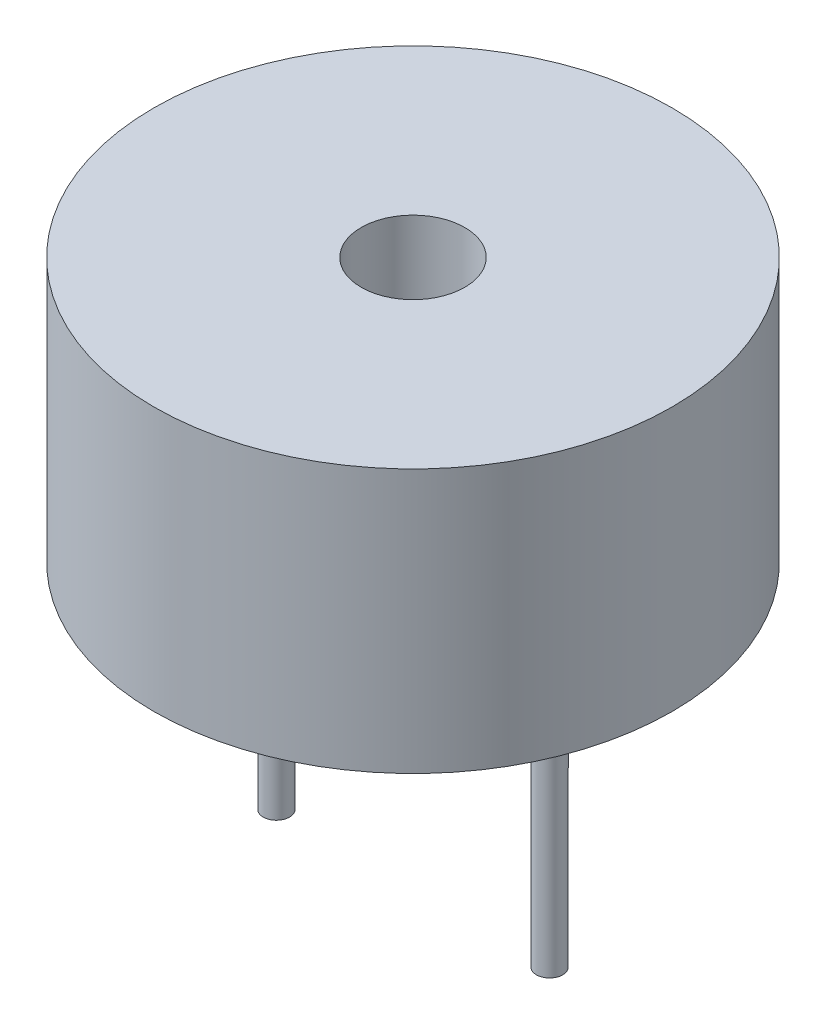
ISO-10303-21;
HEADER;
FILE_DESCRIPTION(('STEP AP214'),'2;1');
FILE_NAME('part.step','',(''),(''),'','','');
FILE_SCHEMA(('AUTOMOTIVE_DESIGN { 1 0 10303 214 1 1 1 1 }'));
ENDSEC;
DATA;
#1=APPLICATION_CONTEXT('core data for automotive mechanical design processes');
#2=APPLICATION_PROTOCOL_DEFINITION('international standard','automotive_design',2000,#1);
#3=PRODUCT_CONTEXT('',#1,'mechanical');
#4=PRODUCT('Part','Part','',(#3));
#5=PRODUCT_RELATED_PRODUCT_CATEGORY('part','',(#4));
#6=PRODUCT_DEFINITION_FORMATION('','',#4);
#7=PRODUCT_DEFINITION_CONTEXT('part definition',#1,'design');
#8=PRODUCT_DEFINITION('design','',#6,#7);
#9=PRODUCT_DEFINITION_SHAPE('','',#8);
#10=(LENGTH_UNIT() NAMED_UNIT(*) SI_UNIT(.MILLI.,.METRE.));
#11=(NAMED_UNIT(*) PLANE_ANGLE_UNIT() SI_UNIT($,.RADIAN.));
#12=(NAMED_UNIT(*) SI_UNIT($,.STERADIAN.) SOLID_ANGLE_UNIT());
#13=UNCERTAINTY_MEASURE_WITH_UNIT(LENGTH_MEASURE(1.E-05),#10,'distance_accuracy_value','');
#14=(GEOMETRIC_REPRESENTATION_CONTEXT(3) GLOBAL_UNCERTAINTY_ASSIGNED_CONTEXT((#13)) GLOBAL_UNIT_ASSIGNED_CONTEXT((#10,
#11,#12)) REPRESENTATION_CONTEXT('',''));
#15=CARTESIAN_POINT('',(0.,0.,0.));
#16=DIRECTION('',(0.,0.,1.));
#17=DIRECTION('',(1.,0.,0.));
#18=AXIS2_PLACEMENT_3D('',#15,#16,#17);
#19=CARTESIAN_POINT('',(0.,0.,0.));
#20=DIRECTION('',(0.,1.,0.));
#21=DIRECTION('',(0.,0.,1.));
#22=AXIS2_PLACEMENT_3D('',#19,#20,#21);
#23=PLANE('',#22);
#24=CARTESIAN_POINT('',(3.683,0.,0.));
#25=DIRECTION('',(0.,1.,0.));
#26=DIRECTION('',(0.,0.,1.));
#27=AXIS2_PLACEMENT_3D('',#24,#25,#26);
#28=CIRCLE('',#27,0.3556);
#29=CARTESIAN_POINT('',(3.683,0.,0.3556));
#30=VERTEX_POINT('',#29);
#31=EDGE_CURVE('E39',#30,#30,#28,.F.);
#32=ORIENTED_EDGE('',*,*,#31,.F.);
#33=EDGE_LOOP('',(#32));
#34=FACE_BOUND('',#33,.T.);
#35=CARTESIAN_POINT('',(0.,0.,0.));
#36=DIRECTION('',(0.,1.,0.));
#37=DIRECTION('',(0.,0.,1.));
#38=AXIS2_PLACEMENT_3D('',#35,#36,#37);
#39=CIRCLE('',#38,6.985);
#40=CARTESIAN_POINT('',(0.,0.,6.985));
#41=VERTEX_POINT('',#40);
#42=EDGE_CURVE('E47',#41,#41,#39,.T.);
#43=ORIENTED_EDGE('',*,*,#42,.F.);
#44=EDGE_LOOP('',(#43));
#45=FACE_BOUND('',#44,.T.);
#46=CARTESIAN_POINT('',(-3.683,0.,0.));
#47=DIRECTION('',(0.,1.,0.));
#48=DIRECTION('',(0.,0.,1.));
#49=AXIS2_PLACEMENT_3D('',#46,#47,#48);
#50=CIRCLE('',#49,0.3556);
#51=CARTESIAN_POINT('',(-3.683,0.,0.3556));
#52=VERTEX_POINT('',#51);
#53=EDGE_CURVE('E10',#52,#52,#50,.F.);
#54=ORIENTED_EDGE('',*,*,#53,.F.);
#55=EDGE_LOOP('',(#54));
#56=FACE_BOUND('',#55,.T.);
#57=ADVANCED_FACE('F32',(#34,#45,#56),#23,.F.);
#58=CARTESIAN_POINT('',(0.,7.112,0.));
#59=DIRECTION('',(0.,-1.,0.));
#60=DIRECTION('',(0.,0.,-1.));
#61=AXIS2_PLACEMENT_3D('',#58,#59,#60);
#62=CYLINDRICAL_SURFACE('',#61,6.985);
#63=CARTESIAN_POINT('',(0.,7.112,0.));
#64=DIRECTION('',(0.,1.,0.));
#65=DIRECTION('',(0.,0.,1.));
#66=AXIS2_PLACEMENT_3D('',#63,#64,#65);
#67=CIRCLE('',#66,6.985);
#68=CARTESIAN_POINT('',(0.,7.112,6.985));
#69=VERTEX_POINT('',#68);
#70=EDGE_CURVE('E43',#69,#69,#67,.T.);
#71=ORIENTED_EDGE('',*,*,#70,.F.);
#72=EDGE_LOOP('',(#71));
#73=FACE_BOUND('',#72,.T.);
#74=ORIENTED_EDGE('',*,*,#42,.T.);
#75=EDGE_LOOP('',(#74));
#76=FACE_BOUND('',#75,.T.);
#77=ADVANCED_FACE('F34',(#73,#76),#62,.T.);
#78=CARTESIAN_POINT('',(0.,7.112,0.));
#79=DIRECTION('',(0.,1.,0.));
#80=DIRECTION('',(0.,0.,1.));
#81=AXIS2_PLACEMENT_3D('',#78,#79,#80);
#82=PLANE('',#81);
#83=CARTESIAN_POINT('',(0.,7.112,0.));
#84=DIRECTION('',(0.,1.,0.));
#85=DIRECTION('',(0.,0.,1.));
#86=AXIS2_PLACEMENT_3D('',#83,#84,#85);
#87=CIRCLE('',#86,1.397);
#88=CARTESIAN_POINT('',(0.,7.112,1.397));
#89=VERTEX_POINT('',#88);
#90=EDGE_CURVE('E59',#89,#89,#87,.T.);
#91=ORIENTED_EDGE('',*,*,#90,.F.);
#92=EDGE_LOOP('',(#91));
#93=FACE_BOUND('',#92,.T.);
#94=ORIENTED_EDGE('',*,*,#70,.T.);
#95=EDGE_LOOP('',(#94));
#96=FACE_BOUND('',#95,.T.);
#97=ADVANCED_FACE('F74',(#93,#96),#82,.T.);
#98=CARTESIAN_POINT('',(3.683,-7.62,0.));
#99=DIRECTION('',(0.,1.,0.));
#100=DIRECTION('',(0.,0.,1.));
#101=AXIS2_PLACEMENT_3D('',#98,#99,#100);
#102=CYLINDRICAL_SURFACE('',#101,0.3556);
#103=CARTESIAN_POINT('',(3.683,-7.62,0.));
#104=DIRECTION('',(0.,-1.,0.));
#105=DIRECTION('',(0.,0.,-1.));
#106=AXIS2_PLACEMENT_3D('',#103,#104,#105);
#107=CIRCLE('',#106,0.3556);
#108=CARTESIAN_POINT('',(3.683,-7.62,-0.3556));
#109=VERTEX_POINT('',#108);
#110=EDGE_CURVE('E51',#109,#109,#107,.T.);
#111=ORIENTED_EDGE('',*,*,#110,.F.);
#112=EDGE_LOOP('',(#111));
#113=FACE_BOUND('',#112,.T.);
#114=ORIENTED_EDGE('',*,*,#31,.T.);
#115=EDGE_LOOP('',(#114));
#116=FACE_BOUND('',#115,.T.);
#117=ADVANCED_FACE('F77',(#113,#116),#102,.T.);
#118=CARTESIAN_POINT('',(3.683,-7.62,0.));
#119=DIRECTION('',(0.,-1.,0.));
#120=DIRECTION('',(0.,0.,-1.));
#121=AXIS2_PLACEMENT_3D('',#118,#119,#120);
#122=PLANE('',#121);
#123=ORIENTED_EDGE('',*,*,#110,.T.);
#124=EDGE_LOOP('',(#123));
#125=FACE_BOUND('',#124,.T.);
#126=ADVANCED_FACE('F93',(#125),#122,.T.);
#127=CARTESIAN_POINT('',(-3.683,-7.62,0.));
#128=DIRECTION('',(0.,1.,0.));
#129=DIRECTION('',(0.,0.,1.));
#130=AXIS2_PLACEMENT_3D('',#127,#128,#129);
#131=CYLINDRICAL_SURFACE('',#130,0.3556);
#132=CARTESIAN_POINT('',(-3.683,-7.62,0.));
#133=DIRECTION('',(0.,-1.,0.));
#134=DIRECTION('',(0.,0.,-1.));
#135=AXIS2_PLACEMENT_3D('',#132,#133,#134);
#136=CIRCLE('',#135,0.3556);
#137=CARTESIAN_POINT('',(-3.683,-7.62,-0.3556));
#138=VERTEX_POINT('',#137);
#139=EDGE_CURVE('E55',#138,#138,#136,.T.);
#140=ORIENTED_EDGE('',*,*,#139,.F.);
#141=EDGE_LOOP('',(#140));
#142=FACE_BOUND('',#141,.T.);
#143=ORIENTED_EDGE('',*,*,#53,.T.);
#144=EDGE_LOOP('',(#143));
#145=FACE_BOUND('',#144,.T.);
#146=ADVANCED_FACE('F97',(#142,#145),#131,.T.);
#147=CARTESIAN_POINT('',(-3.683,-7.62,0.));
#148=DIRECTION('',(0.,-1.,0.));
#149=DIRECTION('',(0.,0.,-1.));
#150=AXIS2_PLACEMENT_3D('',#147,#148,#149);
#151=PLANE('',#150);
#152=ORIENTED_EDGE('',*,*,#139,.T.);
#153=EDGE_LOOP('',(#152));
#154=FACE_BOUND('',#153,.T.);
#155=ADVANCED_FACE('F70',(#154),#151,.T.);
#156=CARTESIAN_POINT('',(0.,3.302,0.));
#157=DIRECTION('',(0.,1.,0.));
#158=DIRECTION('',(0.,0.,1.));
#159=AXIS2_PLACEMENT_3D('',#156,#157,#158);
#160=CYLINDRICAL_SURFACE('',#159,1.397);
#161=CARTESIAN_POINT('',(0.,3.302,0.));
#162=DIRECTION('',(0.,1.,0.));
#163=DIRECTION('',(0.,0.,1.));
#164=AXIS2_PLACEMENT_3D('',#161,#162,#163);
#165=CIRCLE('',#164,1.397);
#166=CARTESIAN_POINT('',(0.,3.302,1.397));
#167=VERTEX_POINT('',#166);
#168=EDGE_CURVE('E58',#167,#167,#165,.T.);
#169=CARTESIAN_POINT('',(0.,3.302,1.397));
#170=CARTESIAN_POINT('',(0.,3.3416875,1.397));
#171=CARTESIAN_POINT('',(0.,3.381375,1.397));
#172=CARTESIAN_POINT('',(0.,3.46075,1.397));
#173=CARTESIAN_POINT('',(0.,3.5004375,1.397));
#174=CARTESIAN_POINT('',(0.,3.5798125,1.397));
#175=CARTESIAN_POINT('',(0.,3.6195,1.397));
#176=CARTESIAN_POINT('',(0.,3.698875,1.397));
#177=CARTESIAN_POINT('',(0.,3.7385625,1.397));
#178=CARTESIAN_POINT('',(0.,3.8179375,1.397));
#179=CARTESIAN_POINT('',(0.,3.857625,1.397));
#180=CARTESIAN_POINT('',(0.,3.937,1.397));
#181=CARTESIAN_POINT('',(0.,3.9766875,1.397));
#182=CARTESIAN_POINT('',(0.,4.0560625,1.397));
#183=CARTESIAN_POINT('',(0.,4.09575,1.397));
#184=CARTESIAN_POINT('',(0.,4.175125,1.397));
#185=CARTESIAN_POINT('',(0.,4.2148125,1.397));
#186=CARTESIAN_POINT('',(0.,4.2941875,1.397));
#187=CARTESIAN_POINT('',(0.,4.333875,1.397));
#188=CARTESIAN_POINT('',(0.,4.41325,1.397));
#189=CARTESIAN_POINT('',(0.,4.4529375,1.397));
#190=CARTESIAN_POINT('',(0.,4.5323125,1.397));
#191=CARTESIAN_POINT('',(0.,4.572,1.397));
#192=CARTESIAN_POINT('',(0.,4.651375,1.397));
#193=CARTESIAN_POINT('',(0.,4.6910625,1.397));
#194=CARTESIAN_POINT('',(0.,4.7704375,1.397));
#195=CARTESIAN_POINT('',(0.,4.810125,1.397));
#196=CARTESIAN_POINT('',(0.,4.8895,1.397));
#197=CARTESIAN_POINT('',(0.,4.9291875,1.397));
#198=CARTESIAN_POINT('',(0.,5.0085625,1.397));
#199=CARTESIAN_POINT('',(0.,5.04825,1.397));
#200=CARTESIAN_POINT('',(0.,5.127625,1.397));
#201=CARTESIAN_POINT('',(0.,5.1673125,1.397));
#202=CARTESIAN_POINT('',(0.,5.2466875,1.397));
#203=CARTESIAN_POINT('',(0.,5.286375,1.397));
#204=CARTESIAN_POINT('',(0.,5.36575,1.397));
#205=CARTESIAN_POINT('',(0.,5.4054375,1.397));
#206=CARTESIAN_POINT('',(0.,5.4848125,1.397));
#207=CARTESIAN_POINT('',(0.,5.5245,1.397));
#208=CARTESIAN_POINT('',(0.,5.603875,1.397));
#209=CARTESIAN_POINT('',(0.,5.6435625,1.397));
#210=CARTESIAN_POINT('',(0.,5.7229375,1.397));
#211=CARTESIAN_POINT('',(0.,5.762625,1.397));
#212=CARTESIAN_POINT('',(0.,5.842,1.397));
#213=CARTESIAN_POINT('',(0.,5.8816875,1.397));
#214=CARTESIAN_POINT('',(0.,5.9610625,1.397));
#215=CARTESIAN_POINT('',(0.,6.00075,1.397));
#216=CARTESIAN_POINT('',(0.,6.080125,1.397));
#217=CARTESIAN_POINT('',(0.,6.1198125,1.397));
#218=CARTESIAN_POINT('',(0.,6.1991875,1.397));
#219=CARTESIAN_POINT('',(0.,6.238875,1.397));
#220=CARTESIAN_POINT('',(0.,6.31825,1.397));
#221=CARTESIAN_POINT('',(0.,6.3579375,1.397));
#222=CARTESIAN_POINT('',(0.,6.4373125,1.397));
#223=CARTESIAN_POINT('',(0.,6.477,1.397));
#224=CARTESIAN_POINT('',(0.,6.556375,1.397));
#225=CARTESIAN_POINT('',(0.,6.5960625,1.397));
#226=CARTESIAN_POINT('',(0.,6.6754375,1.397));
#227=CARTESIAN_POINT('',(0.,6.715125,1.397));
#228=CARTESIAN_POINT('',(0.,6.7945,1.397));
#229=CARTESIAN_POINT('',(0.,6.8341875,1.397));
#230=CARTESIAN_POINT('',(0.,6.9135625,1.397));
#231=CARTESIAN_POINT('',(0.,6.95325,1.397));
#232=CARTESIAN_POINT('',(0.,7.032625,1.397));
#233=CARTESIAN_POINT('',(0.,7.0723125,1.397));
#234=CARTESIAN_POINT('',(0.,7.112,1.397));
#235=B_SPLINE_CURVE_WITH_KNOTS('',3,(#169,#170,#171,#172,#173,#174,#175,#176,#177,#178,#179,
#180,#181,#182,#183,#184,#185,#186,#187,#188,#189,#190,#191,#192,#193,#194,#195,#196,#197,#198,
#199,#200,#201,#202,#203,#204,#205,#206,#207,#208,#209,#210,#211,#212,#213,#214,#215,#216,#217,
#218,#219,#220,#221,#222,#223,#224,#225,#226,#227,#228,#229,#230,#231,#232,#233,#234),
.UNSPECIFIED.,.F.,.F.,(4,2,2,2,2,2,2,2,2,2,2,2,2,2,2,2,2,2,2,2,2,2,2,2,2,2,2,2,2,2,2,2,4),(0.,
0.1190625,0.238125,0.357187499999999,0.47625,0.595312499999999,0.714374999999999,
0.833437499999999,0.9525,1.0715625,1.190625,1.3096875,1.42875,1.5478125,1.666875,1.7859375,
1.905,2.0240625,2.143125,2.2621875,2.38125,2.5003125,2.619375,2.7384375,2.8575,2.9765625,
3.095625,3.2146875,3.33375,3.4528125,3.571875,3.6909375,3.81),.UNSPECIFIED.);
#236=EDGE_CURVE('BSEAM67',#167,#89,#235,.T.);
#237=ORIENTED_EDGE('',*,*,#168,.F.);
#238=ORIENTED_EDGE('',*,*,#90,.T.);
#239=ORIENTED_EDGE('',*,*,#236,.T.);
#240=ORIENTED_EDGE('',*,*,#236,.F.);
#241=EDGE_LOOP('',(#237,#239,#238,#240));
#242=FACE_BOUND('',#241,.T.);
#243=ADVANCED_FACE('F67',(#242),#160,.F.);
#244=CARTESIAN_POINT('',(0.,3.302,0.));
#245=DIRECTION('',(0.,1.,0.));
#246=DIRECTION('',(0.,0.,1.));
#247=AXIS2_PLACEMENT_3D('',#244,#245,#246);
#248=PLANE('',#247);
#249=ORIENTED_EDGE('',*,*,#168,.T.);
#250=EDGE_LOOP('',(#249));
#251=FACE_BOUND('',#250,.T.);
#252=ADVANCED_FACE('F65',(#251),#248,.T.);
#253=CLOSED_SHELL('',(#57,#77,#97,#117,#126,#146,#155,#243,#252));
#254=MANIFOLD_SOLID_BREP('B2',#253);
#255=ADVANCED_BREP_SHAPE_REPRESENTATION('',(#18,#254),#14);
#256=SHAPE_DEFINITION_REPRESENTATION(#9,#255);
ENDSEC;
END-ISO-10303-21;
